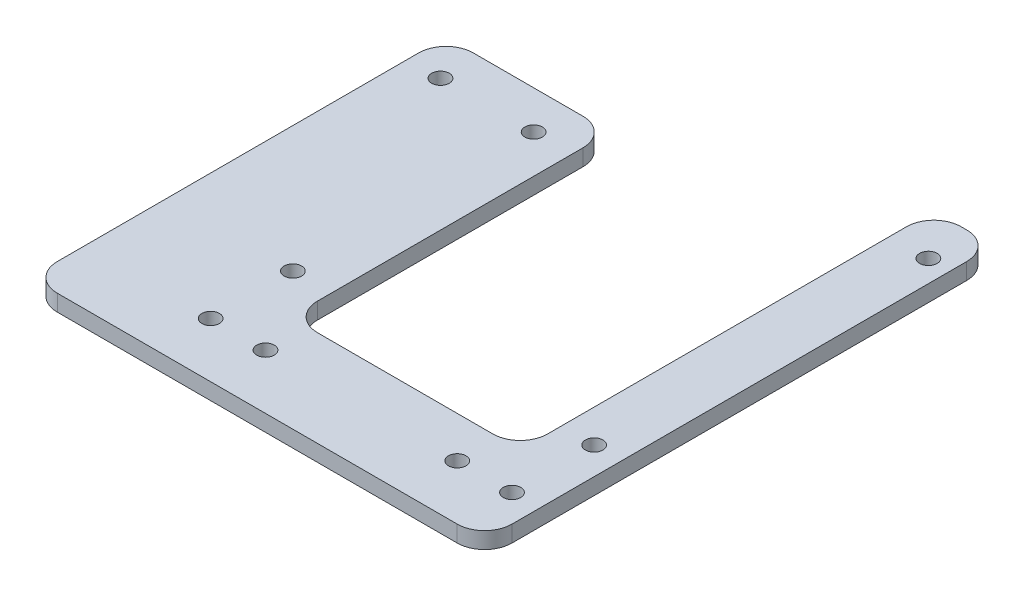
ISO-10303-21;
HEADER;
FILE_DESCRIPTION(('STEP AP214'),'2;1');
FILE_NAME('part.step','',(''),(''),'','','');
FILE_SCHEMA(('AUTOMOTIVE_DESIGN { 1 0 10303 214 1 1 1 1 }'));
ENDSEC;
DATA;
#1=APPLICATION_CONTEXT('core data for automotive mechanical design processes');
#2=APPLICATION_PROTOCOL_DEFINITION('international standard','automotive_design',2000,#1);
#3=PRODUCT_CONTEXT('',#1,'mechanical');
#4=PRODUCT('Part','Part','',(#3));
#5=PRODUCT_RELATED_PRODUCT_CATEGORY('part','',(#4));
#6=PRODUCT_DEFINITION_FORMATION('','',#4);
#7=PRODUCT_DEFINITION_CONTEXT('part definition',#1,'design');
#8=PRODUCT_DEFINITION('design','',#6,#7);
#9=PRODUCT_DEFINITION_SHAPE('','',#8);
#10=(LENGTH_UNIT() NAMED_UNIT(*) SI_UNIT(.MILLI.,.METRE.));
#11=(NAMED_UNIT(*) PLANE_ANGLE_UNIT() SI_UNIT($,.RADIAN.));
#12=(NAMED_UNIT(*) SI_UNIT($,.STERADIAN.) SOLID_ANGLE_UNIT());
#13=UNCERTAINTY_MEASURE_WITH_UNIT(LENGTH_MEASURE(1.E-05),#10,'distance_accuracy_value','');
#14=(GEOMETRIC_REPRESENTATION_CONTEXT(3) GLOBAL_UNCERTAINTY_ASSIGNED_CONTEXT((#13)) GLOBAL_UNIT_ASSIGNED_CONTEXT((#10,
#11,#12)) REPRESENTATION_CONTEXT('',''));
#15=CARTESIAN_POINT('',(0.,0.,0.));
#16=DIRECTION('',(0.,0.,1.));
#17=DIRECTION('',(1.,0.,0.));
#18=AXIS2_PLACEMENT_3D('',#15,#16,#17);
#19=CARTESIAN_POINT('',(190.,3.,-287.));
#20=DIRECTION('',(-1.,0.,0.));
#21=DIRECTION('',(0.,0.,1.));
#22=AXIS2_PLACEMENT_3D('',#19,#20,#21);
#23=PLANE('',#22);
#24=DIRECTION('',(0.,0.,-1.));
#25=VECTOR('',#24,1.);
#26=CARTESIAN_POINT('',(190.,0.,-287.));
#27=LINE('',#26,#25);
#28=CARTESIAN_POINT('',(190.,0.,276.));
#29=VERTEX_POINT('',#28);
#30=CARTESIAN_POINT('',(190.,0.,193.));
#31=VERTEX_POINT('',#30);
#32=EDGE_CURVE('E182',#29,#31,#27,.T.);
#33=ORIENTED_EDGE('',*,*,#32,.T.);
#34=DIRECTION('',(0.,-1.,0.));
#35=VECTOR('',#34,1.);
#36=CARTESIAN_POINT('',(190.,3.,193.));
#37=LINE('',#36,#35);
#38=CARTESIAN_POINT('',(190.,3.,193.));
#39=VERTEX_POINT('',#38);
#40=EDGE_CURVE('E223',#31,#39,#37,.F.);
#41=ORIENTED_EDGE('',*,*,#40,.T.);
#42=DIRECTION('',(0.,0.,-1.));
#43=VECTOR('',#42,1.);
#44=CARTESIAN_POINT('',(190.,3.,0.));
#45=LINE('',#44,#43);
#46=CARTESIAN_POINT('',(190.,3.,276.));
#47=VERTEX_POINT('',#46);
#48=EDGE_CURVE('E177',#47,#39,#45,.T.);
#49=ORIENTED_EDGE('',*,*,#48,.F.);
#50=DIRECTION('',(0.,-1.,0.));
#51=VECTOR('',#50,1.);
#52=CARTESIAN_POINT('',(190.,3.,276.));
#53=LINE('',#52,#51);
#54=EDGE_CURVE('E170',#47,#29,#53,.T.);
#55=ORIENTED_EDGE('',*,*,#54,.T.);
#56=EDGE_LOOP('',(#33,#41,#49,#55));
#57=FACE_BOUND('',#56,.T.);
#58=ADVANCED_FACE('F51',(#57),#23,.F.);
#59=CARTESIAN_POINT('',(0.,3.,0.));
#60=DIRECTION('',(0.,-1.,0.));
#61=DIRECTION('',(0.,0.,-1.));
#62=AXIS2_PLACEMENT_3D('',#59,#60,#61);
#63=PLANE('',#62);
#64=CARTESIAN_POINT('',(113.,3.,212.052631578947));
#65=DIRECTION('',(0.,1.,0.));
#66=DIRECTION('',(0.,0.,1.));
#67=AXIS2_PLACEMENT_3D('',#64,#65,#66);
#68=CIRCLE('',#67,1.59999999999999);
#69=CARTESIAN_POINT('',(113.,3.,213.652631578947));
#70=VERTEX_POINT('',#69);
#71=EDGE_CURVE('E234',#70,#70,#68,.T.);
#72=ORIENTED_EDGE('',*,*,#71,.F.);
#73=EDGE_LOOP('',(#72));
#74=FACE_BOUND('',#73,.T.);
#75=CARTESIAN_POINT('',(130.,3.,212.052631578947));
#76=DIRECTION('',(0.,1.,0.));
#77=DIRECTION('',(0.,0.,1.));
#78=AXIS2_PLACEMENT_3D('',#75,#76,#77);
#79=CIRCLE('',#78,1.59999999999999);
#80=CARTESIAN_POINT('',(130.,3.,213.652631578947));
#81=VERTEX_POINT('',#80);
#82=EDGE_CURVE('E230',#81,#81,#79,.T.);
#83=ORIENTED_EDGE('',*,*,#82,.F.);
#84=EDGE_LOOP('',(#83));
#85=FACE_BOUND('',#84,.T.);
#86=CARTESIAN_POINT('',(186.,3.,196.));
#87=DIRECTION('',(0.,-1.,0.));
#88=DIRECTION('',(0.,0.,-1.));
#89=AXIS2_PLACEMENT_3D('',#86,#87,#88);
#90=CIRCLE('',#89,1.59999999999999);
#91=CARTESIAN_POINT('',(186.,3.,194.4));
#92=VERTEX_POINT('',#91);
#93=EDGE_CURVE('E295',#92,#92,#90,.T.);
#94=ORIENTED_EDGE('',*,*,#93,.T.);
#95=EDGE_LOOP('',(#94));
#96=FACE_BOUND('',#95,.T.);
#97=CARTESIAN_POINT('',(185.,2.99999999999998,271.));
#98=DIRECTION('',(0.,1.,0.));
#99=DIRECTION('',(0.,0.,1.));
#100=AXIS2_PLACEMENT_3D('',#97,#98,#99);
#101=CIRCLE('',#100,1.59999999999999);
#102=CARTESIAN_POINT('',(185.,2.99999999999998,272.6));
#103=VERTEX_POINT('',#102);
#104=EDGE_CURVE('E203',#103,#103,#101,.T.);
#105=ORIENTED_EDGE('',*,*,#104,.F.);
#106=EDGE_LOOP('',(#105));
#107=FACE_BOUND('',#106,.T.);
#108=CARTESIAN_POINT('',(130.,2.99999999999998,271.));
#109=DIRECTION('',(0.,1.,0.));
#110=DIRECTION('',(0.,0.,-1.));
#111=AXIS2_PLACEMENT_3D('',#108,#109,#110);
#112=CIRCLE('',#111,1.59999999999999);
#113=CARTESIAN_POINT('',(130.,2.99999999999998,269.4));
#114=VERTEX_POINT('',#113);
#115=EDGE_CURVE('E338',#114,#114,#112,.T.);
#116=ORIENTED_EDGE('',*,*,#115,.F.);
#117=EDGE_LOOP('',(#116));
#118=FACE_BOUND('',#117,.T.);
#119=CARTESIAN_POINT('',(130.,2.99999999999998,256.));
#120=DIRECTION('',(0.,1.,0.));
#121=DIRECTION('',(0.,0.,-1.));
#122=AXIS2_PLACEMENT_3D('',#119,#120,#121);
#123=CIRCLE('',#122,1.59999999999999);
#124=CARTESIAN_POINT('',(130.,2.99999999999998,254.4));
#125=VERTEX_POINT('',#124);
#126=EDGE_CURVE('E343',#125,#125,#123,.T.);
#127=ORIENTED_EDGE('',*,*,#126,.F.);
#128=EDGE_LOOP('',(#127));
#129=FACE_BOUND('',#128,.T.);
#130=CARTESIAN_POINT('',(185.,2.99999999999998,256.));
#131=DIRECTION('',(0.,1.,0.));
#132=DIRECTION('',(0.,0.,1.));
#133=AXIS2_PLACEMENT_3D('',#130,#131,#132);
#134=CIRCLE('',#133,1.59999999999999);
#135=CARTESIAN_POINT('',(185.,2.99999999999998,257.6));
#136=VERTEX_POINT('',#135);
#137=EDGE_CURVE('E208',#136,#136,#134,.T.);
#138=ORIENTED_EDGE('',*,*,#137,.F.);
#139=EDGE_LOOP('',(#138));
#140=FACE_BOUND('',#139,.T.);
#141=CARTESIAN_POINT('',(175.,3.,271.));
#142=DIRECTION('',(0.,1.,0.));
#143=DIRECTION('',(0.,0.,1.));
#144=AXIS2_PLACEMENT_3D('',#141,#142,#143);
#145=CIRCLE('',#144,1.60000000000002);
#146=CARTESIAN_POINT('',(175.,3.,272.6));
#147=VERTEX_POINT('',#146);
#148=EDGE_CURVE('E333',#147,#147,#145,.T.);
#149=ORIENTED_EDGE('',*,*,#148,.F.);
#150=EDGE_LOOP('',(#149));
#151=FACE_BOUND('',#150,.T.);
#152=CARTESIAN_POINT('',(140.,3.,271.));
#153=DIRECTION('',(0.,1.,0.));
#154=DIRECTION('',(0.,0.,1.));
#155=AXIS2_PLACEMENT_3D('',#152,#153,#154);
#156=CIRCLE('',#155,1.60000000000002);
#157=CARTESIAN_POINT('',(140.,3.,272.6));
#158=VERTEX_POINT('',#157);
#159=EDGE_CURVE('E324',#158,#158,#156,.T.);
#160=ORIENTED_EDGE('',*,*,#159,.F.);
#161=EDGE_LOOP('',(#160));
#162=FACE_BOUND('',#161,.T.);
#163=DIRECTION('',(1.,0.,0.));
#164=VECTOR('',#163,1.);
#165=CARTESIAN_POINT('',(0.,3.,188.));
#166=LINE('',#165,#164);
#167=CARTESIAN_POINT('',(184.,3.,188.));
#168=VERTEX_POINT('',#167);
#169=CARTESIAN_POINT('',(185.,3.,188.));
#170=VERTEX_POINT('',#169);
#171=EDGE_CURVE('E322',#168,#170,#166,.T.);
#172=ORIENTED_EDGE('',*,*,#171,.F.);
#173=CARTESIAN_POINT('',(184.,3.,193.));
#174=DIRECTION('',(0.,-1.,0.));
#175=DIRECTION('',(0.,0.,-1.));
#176=AXIS2_PLACEMENT_3D('',#173,#174,#175);
#177=CIRCLE('',#176,5.);
#178=CARTESIAN_POINT('',(179.,2.99999999999999,193.));
#179=VERTEX_POINT('',#178);
#180=EDGE_CURVE('E259',#168,#179,#177,.F.);
#181=ORIENTED_EDGE('',*,*,#180,.T.);
#182=DIRECTION('',(0.,0.,-1.));
#183=VECTOR('',#182,1.);
#184=CARTESIAN_POINT('',(179.,2.99999999999998,248.));
#185=LINE('',#184,#183);
#186=CARTESIAN_POINT('',(179.,2.99999999999998,258.5));
#187=VERTEX_POINT('',#186);
#188=EDGE_CURVE('E202',#187,#179,#185,.T.);
#189=ORIENTED_EDGE('',*,*,#188,.F.);
#190=CARTESIAN_POINT('',(174.,3.,258.5));
#191=DIRECTION('',(0.,-1.,0.));
#192=DIRECTION('',(0.,0.,-1.));
#193=AXIS2_PLACEMENT_3D('',#190,#191,#192);
#194=CIRCLE('',#193,5.);
#195=CARTESIAN_POINT('',(174.,3.,263.5));
#196=VERTEX_POINT('',#195);
#197=EDGE_CURVE('E280',#187,#196,#194,.T.);
#198=ORIENTED_EDGE('',*,*,#197,.T.);
#199=DIRECTION('',(-1.,0.,0.));
#200=VECTOR('',#199,1.);
#201=CARTESIAN_POINT('',(0.,3.,263.5));
#202=LINE('',#201,#200);
#203=CARTESIAN_POINT('',(142.,3.,263.5));
#204=VERTEX_POINT('',#203);
#205=EDGE_CURVE('E294',#196,#204,#202,.T.);
#206=ORIENTED_EDGE('',*,*,#205,.T.);
#207=CARTESIAN_POINT('',(142.,3.,258.5));
#208=DIRECTION('',(0.,-1.,0.));
#209=DIRECTION('',(0.,0.,-1.));
#210=AXIS2_PLACEMENT_3D('',#207,#208,#209);
#211=CIRCLE('',#210,5.);
#212=CARTESIAN_POINT('',(137.,2.99999999999998,258.5));
#213=VERTEX_POINT('',#212);
#214=EDGE_CURVE('E13',#204,#213,#211,.T.);
#215=ORIENTED_EDGE('',*,*,#214,.T.);
#216=DIRECTION('',(0.,0.,1.));
#217=VECTOR('',#216,1.);
#218=CARTESIAN_POINT('',(137.,2.99999999999998,248.));
#219=LINE('',#218,#217);
#220=CARTESIAN_POINT('',(137.,2.99999999999999,210.052631578947));
#221=VERTEX_POINT('',#220);
#222=EDGE_CURVE('E302',#221,#213,#219,.T.);
#223=ORIENTED_EDGE('',*,*,#222,.F.);
#224=CARTESIAN_POINT('',(132.,3.,210.052631578947));
#225=DIRECTION('',(0.,-1.,0.));
#226=DIRECTION('',(0.,0.,-1.));
#227=AXIS2_PLACEMENT_3D('',#224,#225,#226);
#228=CIRCLE('',#227,5.);
#229=CARTESIAN_POINT('',(132.,3.,205.052631578947));
#230=VERTEX_POINT('',#229);
#231=EDGE_CURVE('E254',#221,#230,#228,.F.);
#232=ORIENTED_EDGE('',*,*,#231,.T.);
#233=DIRECTION('',(-1.,0.,0.));
#234=VECTOR('',#233,1.);
#235=CARTESIAN_POINT('',(0.,3.,205.052631578947));
#236=LINE('',#235,#234);
#237=CARTESIAN_POINT('',(112.,3.,205.052631578947));
#238=VERTEX_POINT('',#237);
#239=EDGE_CURVE('E420',#230,#238,#236,.T.);
#240=ORIENTED_EDGE('',*,*,#239,.T.);
#241=CARTESIAN_POINT('',(112.,3.,210.052631578947));
#242=DIRECTION('',(0.,-1.,0.));
#243=DIRECTION('',(0.,0.,-1.));
#244=AXIS2_PLACEMENT_3D('',#241,#242,#243);
#245=CIRCLE('',#244,5.);
#246=CARTESIAN_POINT('',(107.,3.,210.052631578947));
#247=VERTEX_POINT('',#246);
#248=EDGE_CURVE('E256',#238,#247,#245,.F.);
#249=ORIENTED_EDGE('',*,*,#248,.T.);
#250=DIRECTION('',(0.,0.,1.));
#251=VECTOR('',#250,1.);
#252=CARTESIAN_POINT('',(107.,3.,0.));
#253=LINE('',#252,#251);
#254=CARTESIAN_POINT('',(107.,3.,276.));
#255=VERTEX_POINT('',#254);
#256=EDGE_CURVE('E429',#247,#255,#253,.T.);
#257=ORIENTED_EDGE('',*,*,#256,.T.);
#258=CARTESIAN_POINT('',(112.,3.,276.));
#259=DIRECTION('',(0.,-1.,0.));
#260=DIRECTION('',(0.,0.,-1.));
#261=AXIS2_PLACEMENT_3D('',#258,#259,#260);
#262=CIRCLE('',#261,5.);
#263=CARTESIAN_POINT('',(112.,3.,281.));
#264=VERTEX_POINT('',#263);
#265=EDGE_CURVE('E66',#255,#264,#262,.F.);
#266=ORIENTED_EDGE('',*,*,#265,.T.);
#267=DIRECTION('',(1.,0.,0.));
#268=VECTOR('',#267,1.);
#269=CARTESIAN_POINT('',(144.091695942215,3.,281.));
#270=LINE('',#269,#268);
#271=CARTESIAN_POINT('',(185.,3.,281.));
#272=VERTEX_POINT('',#271);
#273=EDGE_CURVE('E191',#264,#272,#270,.T.);
#274=ORIENTED_EDGE('',*,*,#273,.T.);
#275=CARTESIAN_POINT('',(185.,3.,276.));
#276=DIRECTION('',(0.,-1.,0.));
#277=DIRECTION('',(0.,0.,-1.));
#278=AXIS2_PLACEMENT_3D('',#275,#276,#277);
#279=CIRCLE('',#278,5.);
#280=EDGE_CURVE('E176',#272,#47,#279,.F.);
#281=ORIENTED_EDGE('',*,*,#280,.T.);
#282=ORIENTED_EDGE('',*,*,#48,.T.);
#283=CARTESIAN_POINT('',(185.,3.,193.));
#284=DIRECTION('',(0.,-1.,0.));
#285=DIRECTION('',(0.,0.,-1.));
#286=AXIS2_PLACEMENT_3D('',#283,#284,#285);
#287=CIRCLE('',#286,5.);
#288=EDGE_CURVE('E217',#39,#170,#287,.F.);
#289=ORIENTED_EDGE('',*,*,#288,.T.);
#290=EDGE_LOOP('',(#172,#181,#189,#198,#206,#215,#223,#232,#240,#249,#257,#266,#274,#281,#282,#289));
#291=FACE_BOUND('',#290,.T.);
#292=ADVANCED_FACE('F301',(#74,#85,#96,#107,#118,#129,#140,#151,#162,#291),#63,.F.);
#293=CARTESIAN_POINT('',(0.,0.,0.));
#294=DIRECTION('',(0.,-1.,0.));
#295=DIRECTION('',(0.,0.,-1.));
#296=AXIS2_PLACEMENT_3D('',#293,#294,#295);
#297=PLANE('',#296);
#298=CARTESIAN_POINT('',(113.,0.,212.052631578947));
#299=DIRECTION('',(0.,-1.,0.));
#300=DIRECTION('',(0.,0.,-1.));
#301=AXIS2_PLACEMENT_3D('',#298,#299,#300);
#302=CIRCLE('',#301,1.59999999999999);
#303=CARTESIAN_POINT('',(113.,0.,210.452631578947));
#304=VERTEX_POINT('',#303);
#305=EDGE_CURVE('E231',#304,#304,#302,.T.);
#306=ORIENTED_EDGE('',*,*,#305,.F.);
#307=EDGE_LOOP('',(#306));
#308=FACE_BOUND('',#307,.T.);
#309=CARTESIAN_POINT('',(130.,0.,212.052631578947));
#310=DIRECTION('',(0.,-1.,0.));
#311=DIRECTION('',(0.,0.,-1.));
#312=AXIS2_PLACEMENT_3D('',#309,#310,#311);
#313=CIRCLE('',#312,1.59999999999999);
#314=CARTESIAN_POINT('',(130.,0.,210.452631578947));
#315=VERTEX_POINT('',#314);
#316=EDGE_CURVE('E226',#315,#315,#313,.T.);
#317=ORIENTED_EDGE('',*,*,#316,.F.);
#318=EDGE_LOOP('',(#317));
#319=FACE_BOUND('',#318,.T.);
#320=DIRECTION('',(0.,0.,-1.));
#321=VECTOR('',#320,1.);
#322=CARTESIAN_POINT('',(179.,0.,248.));
#323=LINE('',#322,#321);
#324=CARTESIAN_POINT('',(179.,0.,258.5));
#325=VERTEX_POINT('',#324);
#326=CARTESIAN_POINT('',(179.,0.,193.));
#327=VERTEX_POINT('',#326);
#328=EDGE_CURVE('E307',#325,#327,#323,.T.);
#329=ORIENTED_EDGE('',*,*,#328,.T.);
#330=CARTESIAN_POINT('',(184.,0.,193.));
#331=DIRECTION('',(0.,-1.,0.));
#332=DIRECTION('',(0.,0.,-1.));
#333=AXIS2_PLACEMENT_3D('',#330,#331,#332);
#334=CIRCLE('',#333,5.);
#335=CARTESIAN_POINT('',(184.,0.,188.));
#336=VERTEX_POINT('',#335);
#337=EDGE_CURVE('E250',#327,#336,#334,.T.);
#338=ORIENTED_EDGE('',*,*,#337,.T.);
#339=DIRECTION('',(1.,0.,0.));
#340=VECTOR('',#339,1.);
#341=CARTESIAN_POINT('',(190.,0.,188.));
#342=LINE('',#341,#340);
#343=CARTESIAN_POINT('',(185.,0.,188.));
#344=VERTEX_POINT('',#343);
#345=EDGE_CURVE('E320',#336,#344,#342,.T.);
#346=ORIENTED_EDGE('',*,*,#345,.T.);
#347=CARTESIAN_POINT('',(185.,0.,193.));
#348=DIRECTION('',(0.,-1.,0.));
#349=DIRECTION('',(0.,0.,-1.));
#350=AXIS2_PLACEMENT_3D('',#347,#348,#349);
#351=CIRCLE('',#350,5.);
#352=EDGE_CURVE('E190',#344,#31,#351,.T.);
#353=ORIENTED_EDGE('',*,*,#352,.T.);
#354=ORIENTED_EDGE('',*,*,#32,.F.);
#355=CARTESIAN_POINT('',(185.,0.,276.));
#356=DIRECTION('',(0.,-1.,0.));
#357=DIRECTION('',(0.,0.,-1.));
#358=AXIS2_PLACEMENT_3D('',#355,#356,#357);
#359=CIRCLE('',#358,5.);
#360=CARTESIAN_POINT('',(185.,0.,281.));
#361=VERTEX_POINT('',#360);
#362=EDGE_CURVE('E166',#29,#361,#359,.T.);
#363=ORIENTED_EDGE('',*,*,#362,.T.);
#364=DIRECTION('',(1.,0.,0.));
#365=VECTOR('',#364,1.);
#366=CARTESIAN_POINT('',(190.,0.,281.));
#367=LINE('',#366,#365);
#368=CARTESIAN_POINT('',(112.,0.,281.));
#369=VERTEX_POINT('',#368);
#370=EDGE_CURVE('E192',#369,#361,#367,.T.);
#371=ORIENTED_EDGE('',*,*,#370,.F.);
#372=CARTESIAN_POINT('',(112.,0.,276.));
#373=DIRECTION('',(0.,-1.,0.));
#374=DIRECTION('',(0.,0.,-1.));
#375=AXIS2_PLACEMENT_3D('',#372,#373,#374);
#376=CIRCLE('',#375,5.);
#377=CARTESIAN_POINT('',(107.,0.,276.));
#378=VERTEX_POINT('',#377);
#379=EDGE_CURVE('E248',#369,#378,#376,.T.);
#380=ORIENTED_EDGE('',*,*,#379,.T.);
#381=DIRECTION('',(0.,0.,1.));
#382=VECTOR('',#381,1.);
#383=CARTESIAN_POINT('',(107.,0.,281.));
#384=LINE('',#383,#382);
#385=CARTESIAN_POINT('',(107.,0.,210.052631578947));
#386=VERTEX_POINT('',#385);
#387=EDGE_CURVE('E427',#386,#378,#384,.T.);
#388=ORIENTED_EDGE('',*,*,#387,.F.);
#389=CARTESIAN_POINT('',(112.,0.,210.052631578947));
#390=DIRECTION('',(0.,-1.,0.));
#391=DIRECTION('',(0.,0.,-1.));
#392=AXIS2_PLACEMENT_3D('',#389,#390,#391);
#393=CIRCLE('',#392,5.);
#394=CARTESIAN_POINT('',(112.,0.,205.052631578947));
#395=VERTEX_POINT('',#394);
#396=EDGE_CURVE('E246',#386,#395,#393,.T.);
#397=ORIENTED_EDGE('',*,*,#396,.T.);
#398=DIRECTION('',(-1.,0.,0.));
#399=VECTOR('',#398,1.);
#400=CARTESIAN_POINT('',(107.,0.,205.052631578947));
#401=LINE('',#400,#399);
#402=CARTESIAN_POINT('',(132.,0.,205.052631578947));
#403=VERTEX_POINT('',#402);
#404=EDGE_CURVE('E229',#403,#395,#401,.T.);
#405=ORIENTED_EDGE('',*,*,#404,.F.);
#406=CARTESIAN_POINT('',(132.,0.,210.052631578947));
#407=DIRECTION('',(0.,-1.,0.));
#408=DIRECTION('',(0.,0.,-1.));
#409=AXIS2_PLACEMENT_3D('',#406,#407,#408);
#410=CIRCLE('',#409,5.);
#411=CARTESIAN_POINT('',(137.,0.,210.052631578947));
#412=VERTEX_POINT('',#411);
#413=EDGE_CURVE('E244',#403,#412,#410,.T.);
#414=ORIENTED_EDGE('',*,*,#413,.T.);
#415=DIRECTION('',(0.,0.,1.));
#416=VECTOR('',#415,1.);
#417=CARTESIAN_POINT('',(137.,0.,248.));
#418=LINE('',#417,#416);
#419=CARTESIAN_POINT('',(137.,0.,258.5));
#420=VERTEX_POINT('',#419);
#421=EDGE_CURVE('E195',#412,#420,#418,.T.);
#422=ORIENTED_EDGE('',*,*,#421,.T.);
#423=CARTESIAN_POINT('',(142.,0.,258.5));
#424=DIRECTION('',(0.,-1.,0.));
#425=DIRECTION('',(0.,0.,-1.));
#426=AXIS2_PLACEMENT_3D('',#423,#424,#425);
#427=CIRCLE('',#426,5.);
#428=CARTESIAN_POINT('',(142.,0.,263.5));
#429=VERTEX_POINT('',#428);
#430=EDGE_CURVE('E59',#420,#429,#427,.F.);
#431=ORIENTED_EDGE('',*,*,#430,.T.);
#432=DIRECTION('',(-1.,0.,0.));
#433=VECTOR('',#432,1.);
#434=CARTESIAN_POINT('',(150.,0.,263.5));
#435=LINE('',#434,#433);
#436=CARTESIAN_POINT('',(174.,0.,263.5));
#437=VERTEX_POINT('',#436);
#438=EDGE_CURVE('E284',#437,#429,#435,.T.);
#439=ORIENTED_EDGE('',*,*,#438,.F.);
#440=CARTESIAN_POINT('',(174.,0.,258.5));
#441=DIRECTION('',(0.,-1.,0.));
#442=DIRECTION('',(0.,0.,-1.));
#443=AXIS2_PLACEMENT_3D('',#440,#441,#442);
#444=CIRCLE('',#443,5.);
#445=EDGE_CURVE('E278',#437,#325,#444,.F.);
#446=ORIENTED_EDGE('',*,*,#445,.T.);
#447=EDGE_LOOP('',(#329,#338,#346,#353,#354,#363,#371,#380,#388,#397,#405,#414,#422,#431,#439,#446));
#448=FACE_BOUND('',#447,.T.);
#449=CARTESIAN_POINT('',(186.,0.,196.));
#450=DIRECTION('',(0.,-1.,0.));
#451=DIRECTION('',(0.,0.,1.));
#452=AXIS2_PLACEMENT_3D('',#449,#450,#451);
#453=CIRCLE('',#452,1.59999999999999);
#454=CARTESIAN_POINT('',(186.,0.,197.6));
#455=VERTEX_POINT('',#454);
#456=EDGE_CURVE('E435',#455,#455,#453,.T.);
#457=ORIENTED_EDGE('',*,*,#456,.F.);
#458=EDGE_LOOP('',(#457));
#459=FACE_BOUND('',#458,.T.);
#460=CARTESIAN_POINT('',(185.,0.,271.));
#461=DIRECTION('',(0.,-1.,0.));
#462=DIRECTION('',(0.,0.,-1.));
#463=AXIS2_PLACEMENT_3D('',#460,#461,#462);
#464=CIRCLE('',#463,1.59999999999999);
#465=CARTESIAN_POINT('',(185.,0.,269.4));
#466=VERTEX_POINT('',#465);
#467=EDGE_CURVE('E199',#466,#466,#464,.T.);
#468=ORIENTED_EDGE('',*,*,#467,.F.);
#469=EDGE_LOOP('',(#468));
#470=FACE_BOUND('',#469,.T.);
#471=CARTESIAN_POINT('',(130.,0.,271.));
#472=DIRECTION('',(0.,-1.,0.));
#473=DIRECTION('',(0.,0.,-1.));
#474=AXIS2_PLACEMENT_3D('',#471,#472,#473);
#475=CIRCLE('',#474,1.59999999999999);
#476=CARTESIAN_POINT('',(130.,0.,269.4));
#477=VERTEX_POINT('',#476);
#478=EDGE_CURVE('E204',#477,#477,#475,.T.);
#479=ORIENTED_EDGE('',*,*,#478,.F.);
#480=EDGE_LOOP('',(#479));
#481=FACE_BOUND('',#480,.T.);
#482=CARTESIAN_POINT('',(130.,0.,256.));
#483=DIRECTION('',(0.,-1.,0.));
#484=DIRECTION('',(0.,0.,-1.));
#485=AXIS2_PLACEMENT_3D('',#482,#483,#484);
#486=CIRCLE('',#485,1.59999999999999);
#487=CARTESIAN_POINT('',(130.,0.,254.4));
#488=VERTEX_POINT('',#487);
#489=EDGE_CURVE('E207',#488,#488,#486,.T.);
#490=ORIENTED_EDGE('',*,*,#489,.F.);
#491=EDGE_LOOP('',(#490));
#492=FACE_BOUND('',#491,.T.);
#493=CARTESIAN_POINT('',(185.,0.,256.));
#494=DIRECTION('',(0.,-1.,0.));
#495=DIRECTION('',(0.,0.,-1.));
#496=AXIS2_PLACEMENT_3D('',#493,#494,#495);
#497=CIRCLE('',#496,1.59999999999999);
#498=CARTESIAN_POINT('',(185.,0.,254.4));
#499=VERTEX_POINT('',#498);
#500=EDGE_CURVE('E211',#499,#499,#497,.T.);
#501=ORIENTED_EDGE('',*,*,#500,.F.);
#502=EDGE_LOOP('',(#501));
#503=FACE_BOUND('',#502,.T.);
#504=CARTESIAN_POINT('',(175.,0.,271.));
#505=DIRECTION('',(0.,1.,0.));
#506=DIRECTION('',(0.,0.,1.));
#507=AXIS2_PLACEMENT_3D('',#504,#505,#506);
#508=CIRCLE('',#507,1.60000000000002);
#509=CARTESIAN_POINT('',(175.,0.,272.6));
#510=VERTEX_POINT('',#509);
#511=EDGE_CURVE('E335',#510,#510,#508,.T.);
#512=ORIENTED_EDGE('',*,*,#511,.T.);
#513=EDGE_LOOP('',(#512));
#514=FACE_BOUND('',#513,.T.);
#515=CARTESIAN_POINT('',(140.,0.,271.));
#516=DIRECTION('',(0.,1.,0.));
#517=DIRECTION('',(0.,0.,1.));
#518=AXIS2_PLACEMENT_3D('',#515,#516,#517);
#519=CIRCLE('',#518,1.60000000000002);
#520=CARTESIAN_POINT('',(140.,0.,272.6));
#521=VERTEX_POINT('',#520);
#522=EDGE_CURVE('E327',#521,#521,#519,.T.);
#523=ORIENTED_EDGE('',*,*,#522,.T.);
#524=EDGE_LOOP('',(#523));
#525=FACE_BOUND('',#524,.T.);
#526=ADVANCED_FACE('F187',(#308,#319,#448,#459,#470,#481,#492,#503,#514,#525),#297,.T.);
#527=CARTESIAN_POINT('',(190.,3.,281.));
#528=DIRECTION('',(0.,0.,-1.));
#529=DIRECTION('',(-1.,0.,0.));
#530=AXIS2_PLACEMENT_3D('',#527,#528,#529);
#531=PLANE('',#530);
#532=ORIENTED_EDGE('',*,*,#273,.F.);
#533=DIRECTION('',(0.,-1.,0.));
#534=VECTOR('',#533,1.);
#535=CARTESIAN_POINT('',(112.,3.,281.));
#536=LINE('',#535,#534);
#537=EDGE_CURVE('E261',#264,#369,#536,.T.);
#538=ORIENTED_EDGE('',*,*,#537,.T.);
#539=ORIENTED_EDGE('',*,*,#370,.T.);
#540=DIRECTION('',(0.,-1.,0.));
#541=VECTOR('',#540,1.);
#542=CARTESIAN_POINT('',(185.,3.,281.));
#543=LINE('',#542,#541);
#544=EDGE_CURVE('E172',#361,#272,#543,.F.);
#545=ORIENTED_EDGE('',*,*,#544,.T.);
#546=EDGE_LOOP('',(#532,#538,#539,#545));
#547=FACE_BOUND('',#546,.T.);
#548=ADVANCED_FACE('F388',(#547),#531,.F.);
#549=CARTESIAN_POINT('',(179.,0.,248.));
#550=DIRECTION('',(1.,0.,0.));
#551=DIRECTION('',(0.,0.,-1.));
#552=AXIS2_PLACEMENT_3D('',#549,#550,#551);
#553=PLANE('',#552);
#554=ORIENTED_EDGE('',*,*,#328,.F.);
#555=DIRECTION('',(0.,-1.,0.));
#556=VECTOR('',#555,1.);
#557=CARTESIAN_POINT('',(179.,3.,258.5));
#558=LINE('',#557,#556);
#559=EDGE_CURVE('E242',#325,#187,#558,.F.);
#560=ORIENTED_EDGE('',*,*,#559,.T.);
#561=ORIENTED_EDGE('',*,*,#188,.T.);
#562=DIRECTION('',(0.,-1.,0.));
#563=VECTOR('',#562,1.);
#564=CARTESIAN_POINT('',(179.,0.,193.));
#565=LINE('',#564,#563);
#566=EDGE_CURVE('E239',#179,#327,#565,.T.);
#567=ORIENTED_EDGE('',*,*,#566,.T.);
#568=EDGE_LOOP('',(#554,#560,#561,#567));
#569=FACE_BOUND('',#568,.T.);
#570=ADVANCED_FACE('F390',(#569),#553,.F.);
#571=CARTESIAN_POINT('',(137.,0.,248.));
#572=DIRECTION('',(-1.,0.,0.));
#573=DIRECTION('',(0.,0.,1.));
#574=AXIS2_PLACEMENT_3D('',#571,#572,#573);
#575=PLANE('',#574);
#576=ORIENTED_EDGE('',*,*,#421,.F.);
#577=DIRECTION('',(0.,-1.,0.));
#578=VECTOR('',#577,1.);
#579=CARTESIAN_POINT('',(137.,0.,210.052631578947));
#580=LINE('',#579,#578);
#581=EDGE_CURVE('E276',#412,#221,#580,.F.);
#582=ORIENTED_EDGE('',*,*,#581,.T.);
#583=ORIENTED_EDGE('',*,*,#222,.T.);
#584=DIRECTION('',(0.,-1.,0.));
#585=VECTOR('',#584,1.);
#586=CARTESIAN_POINT('',(137.,0.,258.5));
#587=LINE('',#586,#585);
#588=EDGE_CURVE('E273',#213,#420,#587,.T.);
#589=ORIENTED_EDGE('',*,*,#588,.T.);
#590=EDGE_LOOP('',(#576,#582,#583,#589));
#591=FACE_BOUND('',#590,.T.);
#592=ADVANCED_FACE('F305',(#591),#575,.F.);
#593=CARTESIAN_POINT('',(185.,-7.00000000000002,271.));
#594=DIRECTION('',(0.,1.,0.));
#595=DIRECTION('',(0.,0.,1.));
#596=AXIS2_PLACEMENT_3D('',#593,#594,#595);
#597=CYLINDRICAL_SURFACE('',#596,1.59999999999999);
#598=ORIENTED_EDGE('',*,*,#467,.T.);
#599=EDGE_LOOP('',(#598));
#600=FACE_BOUND('',#599,.T.);
#601=ORIENTED_EDGE('',*,*,#104,.T.);
#602=EDGE_LOOP('',(#601));
#603=FACE_BOUND('',#602,.T.);
#604=ADVANCED_FACE('F351',(#600,#603),#597,.F.);
#605=CARTESIAN_POINT('',(130.,-7.00000000000002,271.));
#606=DIRECTION('',(0.,1.,0.));
#607=DIRECTION('',(0.,0.,1.));
#608=AXIS2_PLACEMENT_3D('',#605,#606,#607);
#609=CYLINDRICAL_SURFACE('',#608,1.59999999999999);
#610=ORIENTED_EDGE('',*,*,#478,.T.);
#611=EDGE_LOOP('',(#610));
#612=FACE_BOUND('',#611,.T.);
#613=ORIENTED_EDGE('',*,*,#115,.T.);
#614=EDGE_LOOP('',(#613));
#615=FACE_BOUND('',#614,.T.);
#616=ADVANCED_FACE('F573',(#612,#615),#609,.F.);
#617=CARTESIAN_POINT('',(130.,-7.00000000000002,256.));
#618=DIRECTION('',(0.,1.,0.));
#619=DIRECTION('',(0.,0.,1.));
#620=AXIS2_PLACEMENT_3D('',#617,#618,#619);
#621=CYLINDRICAL_SURFACE('',#620,1.59999999999999);
#622=ORIENTED_EDGE('',*,*,#489,.T.);
#623=EDGE_LOOP('',(#622));
#624=FACE_BOUND('',#623,.T.);
#625=ORIENTED_EDGE('',*,*,#126,.T.);
#626=EDGE_LOOP('',(#625));
#627=FACE_BOUND('',#626,.T.);
#628=ADVANCED_FACE('F580',(#624,#627),#621,.F.);
#629=CARTESIAN_POINT('',(185.,-7.00000000000002,256.));
#630=DIRECTION('',(0.,1.,0.));
#631=DIRECTION('',(0.,0.,1.));
#632=AXIS2_PLACEMENT_3D('',#629,#630,#631);
#633=CYLINDRICAL_SURFACE('',#632,1.59999999999999);
#634=ORIENTED_EDGE('',*,*,#500,.T.);
#635=EDGE_LOOP('',(#634));
#636=FACE_BOUND('',#635,.T.);
#637=ORIENTED_EDGE('',*,*,#137,.T.);
#638=EDGE_LOOP('',(#637));
#639=FACE_BOUND('',#638,.T.);
#640=ADVANCED_FACE('F377',(#636,#639),#633,.F.);
#641=CARTESIAN_POINT('',(175.,0.,271.));
#642=DIRECTION('',(0.,1.,0.));
#643=DIRECTION('',(0.,0.,1.));
#644=AXIS2_PLACEMENT_3D('',#641,#642,#643);
#645=CYLINDRICAL_SURFACE('',#644,1.60000000000002);
#646=ORIENTED_EDGE('',*,*,#511,.F.);
#647=EDGE_LOOP('',(#646));
#648=FACE_BOUND('',#647,.T.);
#649=ORIENTED_EDGE('',*,*,#148,.T.);
#650=EDGE_LOOP('',(#649));
#651=FACE_BOUND('',#650,.T.);
#652=ADVANCED_FACE('F369',(#648,#651),#645,.F.);
#653=CARTESIAN_POINT('',(140.,0.,271.));
#654=DIRECTION('',(0.,1.,0.));
#655=DIRECTION('',(0.,0.,1.));
#656=AXIS2_PLACEMENT_3D('',#653,#654,#655);
#657=CYLINDRICAL_SURFACE('',#656,1.60000000000002);
#658=ORIENTED_EDGE('',*,*,#522,.F.);
#659=EDGE_LOOP('',(#658));
#660=FACE_BOUND('',#659,.T.);
#661=ORIENTED_EDGE('',*,*,#159,.T.);
#662=EDGE_LOOP('',(#661));
#663=FACE_BOUND('',#662,.T.);
#664=ADVANCED_FACE('F367',(#660,#663),#657,.F.);
#665=CARTESIAN_POINT('',(185.,3.,276.));
#666=DIRECTION('',(0.,-1.,0.));
#667=DIRECTION('',(0.,0.,-1.));
#668=AXIS2_PLACEMENT_3D('',#665,#666,#667);
#669=CYLINDRICAL_SURFACE('',#668,5.);
#670=ORIENTED_EDGE('',*,*,#280,.F.);
#671=ORIENTED_EDGE('',*,*,#544,.F.);
#672=ORIENTED_EDGE('',*,*,#362,.F.);
#673=ORIENTED_EDGE('',*,*,#54,.F.);
#674=EDGE_LOOP('',(#670,#671,#672,#673));
#675=FACE_BOUND('',#674,.T.);
#676=ADVANCED_FACE('F169',(#675),#669,.T.);
#677=CARTESIAN_POINT('',(190.,10.,188.));
#678=DIRECTION('',(0.,0.,-1.));
#679=DIRECTION('',(-1.,0.,0.));
#680=AXIS2_PLACEMENT_3D('',#677,#678,#679);
#681=PLANE('',#680);
#682=ORIENTED_EDGE('',*,*,#345,.F.);
#683=DIRECTION('',(0.,-1.,0.));
#684=VECTOR('',#683,1.);
#685=CARTESIAN_POINT('',(184.,3.,188.));
#686=LINE('',#685,#684);
#687=EDGE_CURVE('E252',#336,#168,#686,.F.);
#688=ORIENTED_EDGE('',*,*,#687,.T.);
#689=ORIENTED_EDGE('',*,*,#171,.T.);
#690=DIRECTION('',(0.,-1.,0.));
#691=VECTOR('',#690,1.);
#692=CARTESIAN_POINT('',(185.,0.,188.));
#693=LINE('',#692,#691);
#694=EDGE_CURVE('E220',#170,#344,#693,.T.);
#695=ORIENTED_EDGE('',*,*,#694,.T.);
#696=EDGE_LOOP('',(#682,#688,#689,#695));
#697=FACE_BOUND('',#696,.T.);
#698=ADVANCED_FACE('F319',(#697),#681,.T.);
#699=CARTESIAN_POINT('',(185.,10.,193.));
#700=DIRECTION('',(0.,1.,0.));
#701=DIRECTION('',(0.,0.,1.));
#702=AXIS2_PLACEMENT_3D('',#699,#700,#701);
#703=CYLINDRICAL_SURFACE('',#702,5.);
#704=ORIENTED_EDGE('',*,*,#288,.F.);
#705=ORIENTED_EDGE('',*,*,#40,.F.);
#706=ORIENTED_EDGE('',*,*,#352,.F.);
#707=ORIENTED_EDGE('',*,*,#694,.F.);
#708=EDGE_LOOP('',(#704,#705,#706,#707));
#709=FACE_BOUND('',#708,.T.);
#710=ADVANCED_FACE('F316',(#709),#703,.T.);
#711=CARTESIAN_POINT('',(150.,10.,263.5));
#712=DIRECTION('',(0.,0.,1.));
#713=DIRECTION('',(1.,0.,0.));
#714=AXIS2_PLACEMENT_3D('',#711,#712,#713);
#715=PLANE('',#714);
#716=ORIENTED_EDGE('',*,*,#205,.F.);
#717=DIRECTION('',(0.,-1.,0.));
#718=VECTOR('',#717,1.);
#719=CARTESIAN_POINT('',(174.,0.,263.5));
#720=LINE('',#719,#718);
#721=EDGE_CURVE('E236',#196,#437,#720,.T.);
#722=ORIENTED_EDGE('',*,*,#721,.T.);
#723=ORIENTED_EDGE('',*,*,#438,.T.);
#724=DIRECTION('',(0.,-1.,0.));
#725=VECTOR('',#724,1.);
#726=CARTESIAN_POINT('',(142.,3.,263.5));
#727=LINE('',#726,#725);
#728=EDGE_CURVE('E225',#429,#204,#727,.F.);
#729=ORIENTED_EDGE('',*,*,#728,.T.);
#730=EDGE_LOOP('',(#716,#722,#723,#729));
#731=FACE_BOUND('',#730,.T.);
#732=ADVANCED_FACE('F291',(#731),#715,.F.);
#733=CARTESIAN_POINT('',(186.,10.,196.));
#734=DIRECTION('',(0.,-1.,0.));
#735=DIRECTION('',(0.,0.,-1.));
#736=AXIS2_PLACEMENT_3D('',#733,#734,#735);
#737=CYLINDRICAL_SURFACE('',#736,1.59999999999999);
#738=ORIENTED_EDGE('',*,*,#456,.T.);
#739=EDGE_LOOP('',(#738));
#740=FACE_BOUND('',#739,.T.);
#741=ORIENTED_EDGE('',*,*,#93,.F.);
#742=EDGE_LOOP('',(#741));
#743=FACE_BOUND('',#742,.T.);
#744=ADVANCED_FACE('F442',(#740,#743),#737,.F.);
#745=CARTESIAN_POINT('',(107.,10.,281.));
#746=DIRECTION('',(1.,0.,0.));
#747=DIRECTION('',(0.,0.,-1.));
#748=AXIS2_PLACEMENT_3D('',#745,#746,#747);
#749=PLANE('',#748);
#750=ORIENTED_EDGE('',*,*,#387,.T.);
#751=DIRECTION('',(0.,-1.,0.));
#752=VECTOR('',#751,1.);
#753=CARTESIAN_POINT('',(107.,10.,276.));
#754=LINE('',#753,#752);
#755=EDGE_CURVE('E74',#378,#255,#754,.F.);
#756=ORIENTED_EDGE('',*,*,#755,.T.);
#757=ORIENTED_EDGE('',*,*,#256,.F.);
#758=DIRECTION('',(0.,-1.,0.));
#759=VECTOR('',#758,1.);
#760=CARTESIAN_POINT('',(107.,10.,210.052631578947));
#761=LINE('',#760,#759);
#762=EDGE_CURVE('E264',#247,#386,#761,.T.);
#763=ORIENTED_EDGE('',*,*,#762,.T.);
#764=EDGE_LOOP('',(#750,#756,#757,#763));
#765=FACE_BOUND('',#764,.T.);
#766=ADVANCED_FACE('F444',(#765),#749,.F.);
#767=CARTESIAN_POINT('',(107.,10.,205.052631578947));
#768=DIRECTION('',(0.,0.,1.));
#769=DIRECTION('',(1.,0.,0.));
#770=AXIS2_PLACEMENT_3D('',#767,#768,#769);
#771=PLANE('',#770);
#772=ORIENTED_EDGE('',*,*,#404,.T.);
#773=DIRECTION('',(0.,-1.,0.));
#774=VECTOR('',#773,1.);
#775=CARTESIAN_POINT('',(112.,10.,205.052631578947));
#776=LINE('',#775,#774);
#777=EDGE_CURVE('E271',#395,#238,#776,.F.);
#778=ORIENTED_EDGE('',*,*,#777,.T.);
#779=ORIENTED_EDGE('',*,*,#239,.F.);
#780=DIRECTION('',(0.,-1.,0.));
#781=VECTOR('',#780,1.);
#782=CARTESIAN_POINT('',(132.,10.,205.052631578947));
#783=LINE('',#782,#781);
#784=EDGE_CURVE('E268',#230,#403,#783,.T.);
#785=ORIENTED_EDGE('',*,*,#784,.T.);
#786=EDGE_LOOP('',(#772,#778,#779,#785));
#787=FACE_BOUND('',#786,.T.);
#788=ADVANCED_FACE('F424',(#787),#771,.F.);
#789=CARTESIAN_POINT('',(130.,-7.,212.052631578947));
#790=DIRECTION('',(0.,1.,0.));
#791=DIRECTION('',(0.,0.,1.));
#792=AXIS2_PLACEMENT_3D('',#789,#790,#791);
#793=CYLINDRICAL_SURFACE('',#792,1.59999999999999);
#794=ORIENTED_EDGE('',*,*,#316,.T.);
#795=EDGE_LOOP('',(#794));
#796=FACE_BOUND('',#795,.T.);
#797=ORIENTED_EDGE('',*,*,#82,.T.);
#798=EDGE_LOOP('',(#797));
#799=FACE_BOUND('',#798,.T.);
#800=ADVANCED_FACE('F485',(#796,#799),#793,.F.);
#801=CARTESIAN_POINT('',(113.,-7.,212.052631578947));
#802=DIRECTION('',(0.,1.,0.));
#803=DIRECTION('',(0.,0.,1.));
#804=AXIS2_PLACEMENT_3D('',#801,#802,#803);
#805=CYLINDRICAL_SURFACE('',#804,1.59999999999999);
#806=ORIENTED_EDGE('',*,*,#305,.T.);
#807=EDGE_LOOP('',(#806));
#808=FACE_BOUND('',#807,.T.);
#809=ORIENTED_EDGE('',*,*,#71,.T.);
#810=EDGE_LOOP('',(#809));
#811=FACE_BOUND('',#810,.T.);
#812=ADVANCED_FACE('F399',(#808,#811),#805,.F.);
#813=CARTESIAN_POINT('',(174.,10.,258.5));
#814=DIRECTION('',(0.,1.,0.));
#815=DIRECTION('',(0.,0.,1.));
#816=AXIS2_PLACEMENT_3D('',#813,#814,#815);
#817=CYLINDRICAL_SURFACE('',#816,5.);
#818=ORIENTED_EDGE('',*,*,#197,.F.);
#819=ORIENTED_EDGE('',*,*,#559,.F.);
#820=ORIENTED_EDGE('',*,*,#445,.F.);
#821=ORIENTED_EDGE('',*,*,#721,.F.);
#822=EDGE_LOOP('',(#818,#819,#820,#821));
#823=FACE_BOUND('',#822,.T.);
#824=ADVANCED_FACE('F395',(#823),#817,.F.);
#825=CARTESIAN_POINT('',(184.,0.,193.));
#826=DIRECTION('',(0.,1.,0.));
#827=DIRECTION('',(0.,0.,1.));
#828=AXIS2_PLACEMENT_3D('',#825,#826,#827);
#829=CYLINDRICAL_SURFACE('',#828,5.);
#830=ORIENTED_EDGE('',*,*,#180,.F.);
#831=ORIENTED_EDGE('',*,*,#687,.F.);
#832=ORIENTED_EDGE('',*,*,#337,.F.);
#833=ORIENTED_EDGE('',*,*,#566,.F.);
#834=EDGE_LOOP('',(#830,#831,#832,#833));
#835=FACE_BOUND('',#834,.T.);
#836=ADVANCED_FACE('F398',(#835),#829,.T.);
#837=CARTESIAN_POINT('',(112.,3.,276.));
#838=DIRECTION('',(0.,-1.,0.));
#839=DIRECTION('',(0.,0.,-1.));
#840=AXIS2_PLACEMENT_3D('',#837,#838,#839);
#841=CYLINDRICAL_SURFACE('',#840,5.);
#842=ORIENTED_EDGE('',*,*,#265,.F.);
#843=ORIENTED_EDGE('',*,*,#755,.F.);
#844=ORIENTED_EDGE('',*,*,#379,.F.);
#845=ORIENTED_EDGE('',*,*,#537,.F.);
#846=EDGE_LOOP('',(#842,#843,#844,#845));
#847=FACE_BOUND('',#846,.T.);
#848=ADVANCED_FACE('F403',(#847),#841,.T.);
#849=CARTESIAN_POINT('',(112.,10.,210.052631578947));
#850=DIRECTION('',(0.,-1.,0.));
#851=DIRECTION('',(0.,0.,-1.));
#852=AXIS2_PLACEMENT_3D('',#849,#850,#851);
#853=CYLINDRICAL_SURFACE('',#852,5.);
#854=ORIENTED_EDGE('',*,*,#248,.F.);
#855=ORIENTED_EDGE('',*,*,#777,.F.);
#856=ORIENTED_EDGE('',*,*,#396,.F.);
#857=ORIENTED_EDGE('',*,*,#762,.F.);
#858=EDGE_LOOP('',(#854,#855,#856,#857));
#859=FACE_BOUND('',#858,.T.);
#860=ADVANCED_FACE('F407',(#859),#853,.T.);
#861=CARTESIAN_POINT('',(132.,10.,210.052631578947));
#862=DIRECTION('',(0.,-1.,0.));
#863=DIRECTION('',(0.,0.,-1.));
#864=AXIS2_PLACEMENT_3D('',#861,#862,#863);
#865=CYLINDRICAL_SURFACE('',#864,5.);
#866=ORIENTED_EDGE('',*,*,#231,.F.);
#867=ORIENTED_EDGE('',*,*,#581,.F.);
#868=ORIENTED_EDGE('',*,*,#413,.F.);
#869=ORIENTED_EDGE('',*,*,#784,.F.);
#870=EDGE_LOOP('',(#866,#867,#868,#869));
#871=FACE_BOUND('',#870,.T.);
#872=ADVANCED_FACE('F410',(#871),#865,.T.);
#873=CARTESIAN_POINT('',(142.,0.,258.5));
#874=DIRECTION('',(0.,1.,0.));
#875=DIRECTION('',(0.,0.,1.));
#876=AXIS2_PLACEMENT_3D('',#873,#874,#875);
#877=CYLINDRICAL_SURFACE('',#876,5.);
#878=ORIENTED_EDGE('',*,*,#214,.F.);
#879=ORIENTED_EDGE('',*,*,#728,.F.);
#880=ORIENTED_EDGE('',*,*,#430,.F.);
#881=ORIENTED_EDGE('',*,*,#588,.F.);
#882=EDGE_LOOP('',(#878,#879,#880,#881));
#883=FACE_BOUND('',#882,.T.);
#884=ADVANCED_FACE('F53',(#883),#877,.F.);
#885=CLOSED_SHELL('',(#58,#292,#526,#548,#570,#592,#604,#616,#628,#640,#652,#664,#676,#698,#710,
#732,#744,#766,#788,#800,#812,#824,#836,#848,#860,#872,#884));
#886=MANIFOLD_SOLID_BREP('B2',#885);
#887=ADVANCED_BREP_SHAPE_REPRESENTATION('',(#18,#886),#14);
#888=SHAPE_DEFINITION_REPRESENTATION(#9,#887);
ENDSEC;
END-ISO-10303-21;
